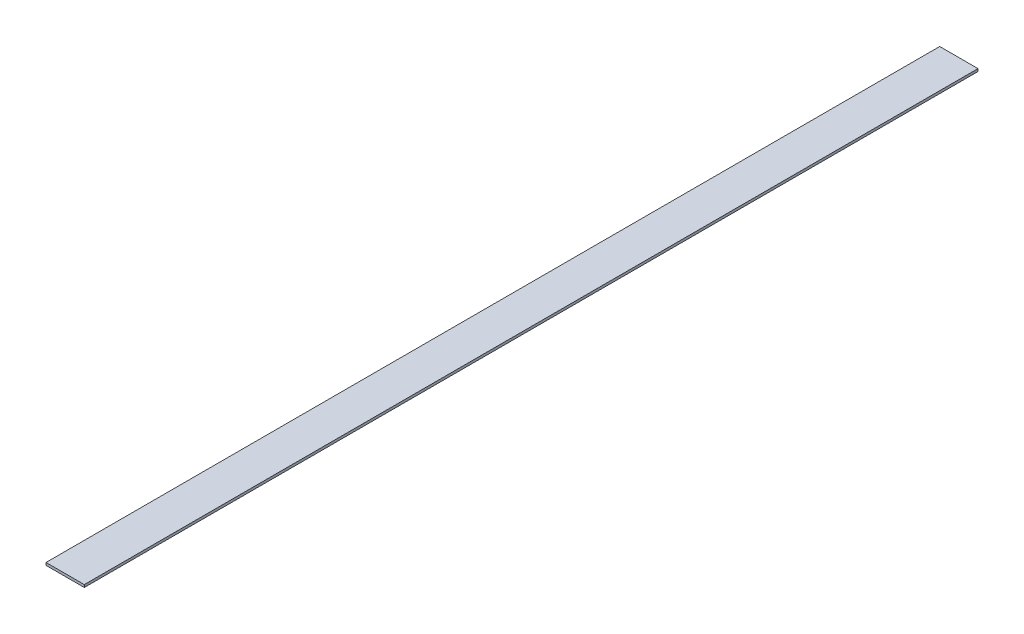
ISO-10303-21;
HEADER;
FILE_DESCRIPTION(('STEP AP214'),'2;1');
FILE_NAME('part.step','',(''),(''),'','','');
FILE_SCHEMA(('AUTOMOTIVE_DESIGN { 1 0 10303 214 1 1 1 1 }'));
ENDSEC;
DATA;
#1=APPLICATION_CONTEXT('core data for automotive mechanical design processes');
#2=APPLICATION_PROTOCOL_DEFINITION('international standard','automotive_design',2000,#1);
#3=PRODUCT_CONTEXT('',#1,'mechanical');
#4=PRODUCT('Part','Part','',(#3));
#5=PRODUCT_RELATED_PRODUCT_CATEGORY('part','',(#4));
#6=PRODUCT_DEFINITION_FORMATION('','',#4);
#7=PRODUCT_DEFINITION_CONTEXT('part definition',#1,'design');
#8=PRODUCT_DEFINITION('design','',#6,#7);
#9=PRODUCT_DEFINITION_SHAPE('','',#8);
#10=(LENGTH_UNIT() NAMED_UNIT(*) SI_UNIT(.MILLI.,.METRE.));
#11=(NAMED_UNIT(*) PLANE_ANGLE_UNIT() SI_UNIT($,.RADIAN.));
#12=(NAMED_UNIT(*) SI_UNIT($,.STERADIAN.) SOLID_ANGLE_UNIT());
#13=UNCERTAINTY_MEASURE_WITH_UNIT(LENGTH_MEASURE(1.E-05),#10,'distance_accuracy_value','');
#14=(GEOMETRIC_REPRESENTATION_CONTEXT(3) GLOBAL_UNCERTAINTY_ASSIGNED_CONTEXT((#13)) GLOBAL_UNIT_ASSIGNED_CONTEXT((#10,
#11,#12)) REPRESENTATION_CONTEXT('',''));
#15=CARTESIAN_POINT('',(0.,0.,0.));
#16=DIRECTION('',(0.,0.,1.));
#17=DIRECTION('',(1.,0.,0.));
#18=AXIS2_PLACEMENT_3D('',#15,#16,#17);
#19=CARTESIAN_POINT('',(7.50000000000001,0.5,350.));
#20=DIRECTION('',(-1.,0.,0.));
#21=DIRECTION('',(0.,-1.,0.));
#22=AXIS2_PLACEMENT_3D('',#19,#20,#21);
#23=PLANE('',#22);
#24=DIRECTION('',(0.,1.,0.));
#25=VECTOR('',#24,1.);
#26=CARTESIAN_POINT('',(7.50000000000001,0.5,0.));
#27=LINE('',#26,#25);
#28=CARTESIAN_POINT('',(7.50000000000001,-0.5,0.));
#29=VERTEX_POINT('',#28);
#30=CARTESIAN_POINT('',(7.50000000000001,0.5,0.));
#31=VERTEX_POINT('',#30);
#32=EDGE_CURVE('E107',#29,#31,#27,.T.);
#33=ORIENTED_EDGE('',*,*,#32,.T.);
#34=DIRECTION('',(0.,0.,-1.));
#35=VECTOR('',#34,1.);
#36=CARTESIAN_POINT('',(7.50000000000001,0.5,350.));
#37=LINE('',#36,#35);
#38=CARTESIAN_POINT('',(7.50000000000001,0.5,350.));
#39=VERTEX_POINT('',#38);
#40=EDGE_CURVE('E11',#39,#31,#37,.T.);
#41=ORIENTED_EDGE('',*,*,#40,.F.);
#42=DIRECTION('',(0.,1.,0.));
#43=VECTOR('',#42,1.);
#44=CARTESIAN_POINT('',(7.50000000000001,0.5,350.));
#45=LINE('',#44,#43);
#46=CARTESIAN_POINT('',(7.50000000000001,-0.5,350.));
#47=VERTEX_POINT('',#46);
#48=EDGE_CURVE('E91',#47,#39,#45,.T.);
#49=ORIENTED_EDGE('',*,*,#48,.F.);
#50=DIRECTION('',(0.,0.,-1.));
#51=VECTOR('',#50,1.);
#52=CARTESIAN_POINT('',(7.50000000000001,-0.5,350.));
#53=LINE('',#52,#51);
#54=EDGE_CURVE('E103',#47,#29,#53,.T.);
#55=ORIENTED_EDGE('',*,*,#54,.T.);
#56=EDGE_LOOP('',(#33,#41,#49,#55));
#57=FACE_BOUND('',#56,.T.);
#58=ADVANCED_FACE('F39',(#57),#23,.F.);
#59=CARTESIAN_POINT('',(-7.49999999999999,0.5,350.));
#60=DIRECTION('',(0.,-1.,0.));
#61=DIRECTION('',(0.,0.,-1.));
#62=AXIS2_PLACEMENT_3D('',#59,#60,#61);
#63=PLANE('',#62);
#64=DIRECTION('',(-1.,0.,0.));
#65=VECTOR('',#64,1.);
#66=CARTESIAN_POINT('',(-7.49999999999999,0.5,0.));
#67=LINE('',#66,#65);
#68=CARTESIAN_POINT('',(-7.49999999999999,0.5,0.));
#69=VERTEX_POINT('',#68);
#70=EDGE_CURVE('E96',#31,#69,#67,.T.);
#71=ORIENTED_EDGE('',*,*,#70,.T.);
#72=DIRECTION('',(0.,0.,-1.));
#73=VECTOR('',#72,1.);
#74=CARTESIAN_POINT('',(-7.49999999999999,0.5,350.));
#75=LINE('',#74,#73);
#76=CARTESIAN_POINT('',(-7.49999999999999,0.5,350.));
#77=VERTEX_POINT('',#76);
#78=EDGE_CURVE('E48',#77,#69,#75,.T.);
#79=ORIENTED_EDGE('',*,*,#78,.F.);
#80=DIRECTION('',(-1.,0.,0.));
#81=VECTOR('',#80,1.);
#82=CARTESIAN_POINT('',(-7.49999999999999,0.5,350.));
#83=LINE('',#82,#81);
#84=EDGE_CURVE('E86',#39,#77,#83,.T.);
#85=ORIENTED_EDGE('',*,*,#84,.F.);
#86=ORIENTED_EDGE('',*,*,#40,.T.);
#87=EDGE_LOOP('',(#71,#79,#85,#86));
#88=FACE_BOUND('',#87,.T.);
#89=ADVANCED_FACE('F95',(#88),#63,.F.);
#90=CARTESIAN_POINT('',(-7.49999999999999,0.5,350.));
#91=DIRECTION('',(1.,0.,0.));
#92=DIRECTION('',(0.,0.,-1.));
#93=AXIS2_PLACEMENT_3D('',#90,#91,#92);
#94=PLANE('',#93);
#95=DIRECTION('',(0.,-1.,0.));
#96=VECTOR('',#95,1.);
#97=CARTESIAN_POINT('',(-7.49999999999999,0.5,0.));
#98=LINE('',#97,#96);
#99=CARTESIAN_POINT('',(-7.49999999999999,-0.5,0.));
#100=VERTEX_POINT('',#99);
#101=EDGE_CURVE('E73',#69,#100,#98,.T.);
#102=ORIENTED_EDGE('',*,*,#101,.T.);
#103=DIRECTION('',(0.,0.,-1.));
#104=VECTOR('',#103,1.);
#105=CARTESIAN_POINT('',(-7.49999999999999,-0.5,350.));
#106=LINE('',#105,#104);
#107=CARTESIAN_POINT('',(-7.49999999999999,-0.5,350.));
#108=VERTEX_POINT('',#107);
#109=EDGE_CURVE('E98',#108,#100,#106,.T.);
#110=ORIENTED_EDGE('',*,*,#109,.F.);
#111=DIRECTION('',(0.,-1.,0.));
#112=VECTOR('',#111,1.);
#113=CARTESIAN_POINT('',(-7.49999999999999,0.5,350.));
#114=LINE('',#113,#112);
#115=EDGE_CURVE('E89',#77,#108,#114,.T.);
#116=ORIENTED_EDGE('',*,*,#115,.F.);
#117=ORIENTED_EDGE('',*,*,#78,.T.);
#118=EDGE_LOOP('',(#102,#110,#116,#117));
#119=FACE_BOUND('',#118,.T.);
#120=ADVANCED_FACE('F99',(#119),#94,.F.);
#121=CARTESIAN_POINT('',(-7.49999999999999,-0.5,350.));
#122=DIRECTION('',(0.,1.,0.));
#123=DIRECTION('',(0.,0.,1.));
#124=AXIS2_PLACEMENT_3D('',#121,#122,#123);
#125=PLANE('',#124);
#126=DIRECTION('',(1.,0.,0.));
#127=VECTOR('',#126,1.);
#128=CARTESIAN_POINT('',(-7.49999999999999,-0.5,0.));
#129=LINE('',#128,#127);
#130=EDGE_CURVE('E79',#100,#29,#129,.T.);
#131=ORIENTED_EDGE('',*,*,#130,.T.);
#132=ORIENTED_EDGE('',*,*,#54,.F.);
#133=DIRECTION('',(1.,0.,0.));
#134=VECTOR('',#133,1.);
#135=CARTESIAN_POINT('',(-7.49999999999999,-0.5,350.));
#136=LINE('',#135,#134);
#137=EDGE_CURVE('E56',#108,#47,#136,.T.);
#138=ORIENTED_EDGE('',*,*,#137,.F.);
#139=ORIENTED_EDGE('',*,*,#109,.T.);
#140=EDGE_LOOP('',(#131,#132,#138,#139));
#141=FACE_BOUND('',#140,.T.);
#142=ADVANCED_FACE('F120',(#141),#125,.F.);
#143=CARTESIAN_POINT('',(0.,0.,350.));
#144=DIRECTION('',(0.,0.,1.));
#145=DIRECTION('',(1.,0.,0.));
#146=AXIS2_PLACEMENT_3D('',#143,#144,#145);
#147=PLANE('',#146);
#148=ORIENTED_EDGE('',*,*,#48,.T.);
#149=ORIENTED_EDGE('',*,*,#84,.T.);
#150=ORIENTED_EDGE('',*,*,#115,.T.);
#151=ORIENTED_EDGE('',*,*,#137,.T.);
#152=EDGE_LOOP('',(#148,#149,#150,#151));
#153=FACE_BOUND('',#152,.T.);
#154=ADVANCED_FACE('F87',(#153),#147,.T.);
#155=CARTESIAN_POINT('',(0.,0.,0.));
#156=DIRECTION('',(0.,0.,1.));
#157=DIRECTION('',(1.,0.,0.));
#158=AXIS2_PLACEMENT_3D('',#155,#156,#157);
#159=PLANE('',#158);
#160=ORIENTED_EDGE('',*,*,#32,.F.);
#161=ORIENTED_EDGE('',*,*,#130,.F.);
#162=ORIENTED_EDGE('',*,*,#101,.F.);
#163=ORIENTED_EDGE('',*,*,#70,.F.);
#164=EDGE_LOOP('',(#160,#161,#162,#163));
#165=FACE_BOUND('',#164,.T.);
#166=ADVANCED_FACE('F123',(#165),#159,.F.);
#167=CLOSED_SHELL('',(#58,#89,#120,#142,#154,#166));
#168=MANIFOLD_SOLID_BREP('B2',#167);
#169=ADVANCED_BREP_SHAPE_REPRESENTATION('',(#18,#168),#14);
#170=SHAPE_DEFINITION_REPRESENTATION(#9,#169);
ENDSEC;
END-ISO-10303-21;
